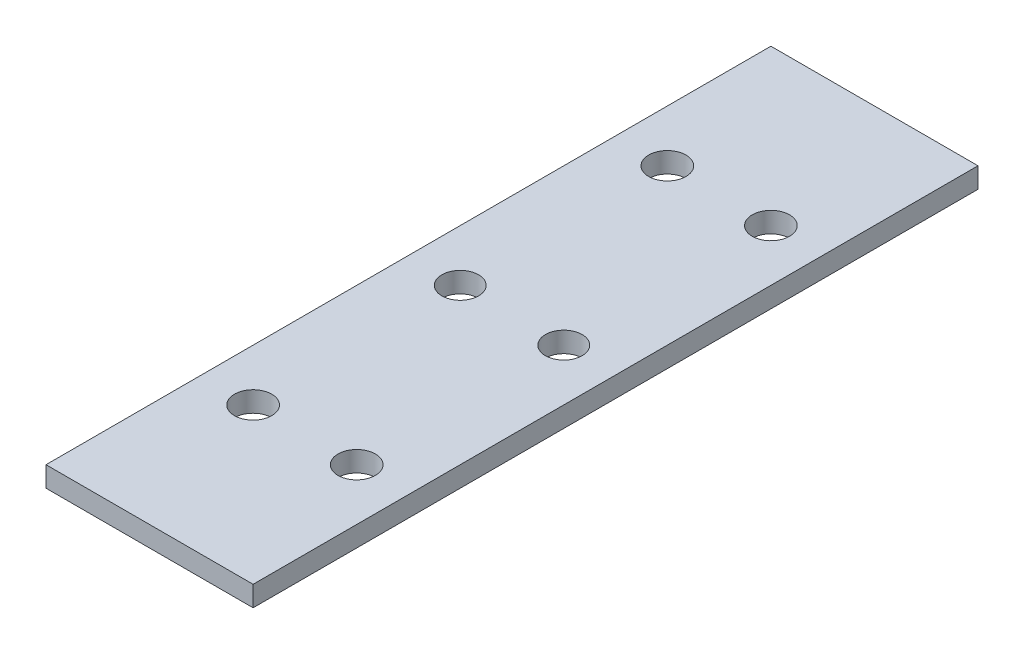
ISO-10303-21;
HEADER;
FILE_DESCRIPTION(('STEP AP214'),'2;1');
FILE_NAME('part.step','',(''),(''),'','','');
FILE_SCHEMA(('AUTOMOTIVE_DESIGN { 1 0 10303 214 1 1 1 1 }'));
ENDSEC;
DATA;
#1=APPLICATION_CONTEXT('core data for automotive mechanical design processes');
#2=APPLICATION_PROTOCOL_DEFINITION('international standard','automotive_design',2000,#1);
#3=PRODUCT_CONTEXT('',#1,'mechanical');
#4=PRODUCT('Part','Part','',(#3));
#5=PRODUCT_RELATED_PRODUCT_CATEGORY('part','',(#4));
#6=PRODUCT_DEFINITION_FORMATION('','',#4);
#7=PRODUCT_DEFINITION_CONTEXT('part definition',#1,'design');
#8=PRODUCT_DEFINITION('design','',#6,#7);
#9=PRODUCT_DEFINITION_SHAPE('','',#8);
#10=(LENGTH_UNIT() NAMED_UNIT(*) SI_UNIT(.MILLI.,.METRE.));
#11=(NAMED_UNIT(*) PLANE_ANGLE_UNIT() SI_UNIT($,.RADIAN.));
#12=(NAMED_UNIT(*) SI_UNIT($,.STERADIAN.) SOLID_ANGLE_UNIT());
#13=UNCERTAINTY_MEASURE_WITH_UNIT(LENGTH_MEASURE(1.E-05),#10,'distance_accuracy_value','');
#14=(GEOMETRIC_REPRESENTATION_CONTEXT(3) GLOBAL_UNCERTAINTY_ASSIGNED_CONTEXT((#13)) GLOBAL_UNIT_ASSIGNED_CONTEXT((#10,
#11,#12)) REPRESENTATION_CONTEXT('',''));
#15=CARTESIAN_POINT('',(0.,0.,0.));
#16=DIRECTION('',(0.,0.,1.));
#17=DIRECTION('',(1.,0.,0.));
#18=AXIS2_PLACEMENT_3D('',#15,#16,#17);
#19=CARTESIAN_POINT('',(0.,2.5,0.));
#20=DIRECTION('',(0.,-1.,0.));
#21=DIRECTION('',(0.,0.,-1.));
#22=AXIS2_PLACEMENT_3D('',#19,#20,#21);
#23=PLANE('',#22);
#24=CARTESIAN_POINT('',(19.0500000000005,2.5,-19.05));
#25=DIRECTION('',(0.,1.,0.));
#26=DIRECTION('',(0.,0.,1.));
#27=AXIS2_PLACEMENT_3D('',#24,#25,#26);
#28=CIRCLE('',#27,2.286);
#29=CARTESIAN_POINT('',(19.0500000000005,2.5,-16.764));
#30=VERTEX_POINT('',#29);
#31=EDGE_CURVE('E132',#30,#30,#28,.T.);
#32=ORIENTED_EDGE('',*,*,#31,.F.);
#33=EDGE_LOOP('',(#32));
#34=FACE_BOUND('',#33,.T.);
#35=CARTESIAN_POINT('',(19.05,2.5,-44.45));
#36=DIRECTION('',(0.,1.,0.));
#37=DIRECTION('',(0.,0.,1.));
#38=AXIS2_PLACEMENT_3D('',#35,#36,#37);
#39=CIRCLE('',#38,2.25);
#40=CARTESIAN_POINT('',(19.05,2.5,-42.2));
#41=VERTEX_POINT('',#40);
#42=EDGE_CURVE('E120',#41,#41,#39,.T.);
#43=ORIENTED_EDGE('',*,*,#42,.F.);
#44=EDGE_LOOP('',(#43));
#45=FACE_BOUND('',#44,.T.);
#46=CARTESIAN_POINT('',(6.35,2.5,-69.85));
#47=DIRECTION('',(0.,1.,0.));
#48=DIRECTION('',(0.,0.,1.));
#49=AXIS2_PLACEMENT_3D('',#46,#47,#48);
#50=CIRCLE('',#49,2.286);
#51=CARTESIAN_POINT('',(6.35,2.5,-67.564));
#52=VERTEX_POINT('',#51);
#53=EDGE_CURVE('E99',#52,#52,#50,.T.);
#54=ORIENTED_EDGE('',*,*,#53,.F.);
#55=EDGE_LOOP('',(#54));
#56=FACE_BOUND('',#55,.T.);
#57=DIRECTION('',(0.,0.,1.));
#58=VECTOR('',#57,1.);
#59=CARTESIAN_POINT('',(0.,2.5,0.));
#60=LINE('',#59,#58);
#61=CARTESIAN_POINT('',(0.,2.5,-88.9));
#62=VERTEX_POINT('',#61);
#63=CARTESIAN_POINT('',(0.,2.5,0.));
#64=VERTEX_POINT('',#63);
#65=EDGE_CURVE('E84',#62,#64,#60,.T.);
#66=ORIENTED_EDGE('',*,*,#65,.T.);
#67=DIRECTION('',(1.,0.,0.));
#68=VECTOR('',#67,1.);
#69=CARTESIAN_POINT('',(0.,2.5,0.));
#70=LINE('',#69,#68);
#71=CARTESIAN_POINT('',(25.4,2.5,0.));
#72=VERTEX_POINT('',#71);
#73=EDGE_CURVE('E79',#64,#72,#70,.T.);
#74=ORIENTED_EDGE('',*,*,#73,.T.);
#75=DIRECTION('',(0.,0.,-1.));
#76=VECTOR('',#75,1.);
#77=CARTESIAN_POINT('',(25.4,2.5,0.));
#78=LINE('',#77,#76);
#79=CARTESIAN_POINT('',(25.4,2.5,-88.9));
#80=VERTEX_POINT('',#79);
#81=EDGE_CURVE('E82',#72,#80,#78,.T.);
#82=ORIENTED_EDGE('',*,*,#81,.T.);
#83=DIRECTION('',(-1.,0.,0.));
#84=VECTOR('',#83,1.);
#85=CARTESIAN_POINT('',(0.,2.5,-88.9));
#86=LINE('',#85,#84);
#87=EDGE_CURVE('E49',#80,#62,#86,.T.);
#88=ORIENTED_EDGE('',*,*,#87,.T.);
#89=EDGE_LOOP('',(#66,#74,#82,#88));
#90=FACE_BOUND('',#89,.T.);
#91=CARTESIAN_POINT('',(6.35,2.5,-44.45));
#92=DIRECTION('',(0.,1.,0.));
#93=DIRECTION('',(0.,0.,1.));
#94=AXIS2_PLACEMENT_3D('',#91,#92,#93);
#95=CIRCLE('',#94,2.25);
#96=CARTESIAN_POINT('',(6.35,2.5,-42.2));
#97=VERTEX_POINT('',#96);
#98=EDGE_CURVE('E114',#97,#97,#95,.T.);
#99=ORIENTED_EDGE('',*,*,#98,.F.);
#100=EDGE_LOOP('',(#99));
#101=FACE_BOUND('',#100,.T.);
#102=CARTESIAN_POINT('',(19.05,2.5,-69.85));
#103=DIRECTION('',(0.,1.,0.));
#104=DIRECTION('',(0.,0.,1.));
#105=AXIS2_PLACEMENT_3D('',#102,#103,#104);
#106=CIRCLE('',#105,2.286);
#107=CARTESIAN_POINT('',(19.05,2.5,-67.564));
#108=VERTEX_POINT('',#107);
#109=EDGE_CURVE('E126',#108,#108,#106,.T.);
#110=ORIENTED_EDGE('',*,*,#109,.F.);
#111=EDGE_LOOP('',(#110));
#112=FACE_BOUND('',#111,.T.);
#113=CARTESIAN_POINT('',(6.35000000000053,2.5,-19.05));
#114=DIRECTION('',(0.,1.,0.));
#115=DIRECTION('',(0.,0.,1.));
#116=AXIS2_PLACEMENT_3D('',#113,#114,#115);
#117=CIRCLE('',#116,2.286);
#118=CARTESIAN_POINT('',(6.35000000000053,2.5,-16.764));
#119=VERTEX_POINT('',#118);
#120=EDGE_CURVE('E138',#119,#119,#117,.T.);
#121=ORIENTED_EDGE('',*,*,#120,.F.);
#122=EDGE_LOOP('',(#121));
#123=FACE_BOUND('',#122,.T.);
#124=ADVANCED_FACE('F32',(#34,#45,#56,#90,#101,#112,#123),#23,.F.);
#125=CARTESIAN_POINT('',(0.,0.,0.));
#126=DIRECTION('',(0.,-1.,0.));
#127=DIRECTION('',(0.,0.,-1.));
#128=AXIS2_PLACEMENT_3D('',#125,#126,#127);
#129=PLANE('',#128);
#130=CARTESIAN_POINT('',(19.0500000000005,0.,-19.05));
#131=DIRECTION('',(0.,1.,0.));
#132=DIRECTION('',(0.,0.,1.));
#133=AXIS2_PLACEMENT_3D('',#130,#131,#132);
#134=CIRCLE('',#133,2.286);
#135=CARTESIAN_POINT('',(19.0500000000005,0.,-16.764));
#136=VERTEX_POINT('',#135);
#137=EDGE_CURVE('E135',#136,#136,#134,.T.);
#138=ORIENTED_EDGE('',*,*,#137,.T.);
#139=EDGE_LOOP('',(#138));
#140=FACE_BOUND('',#139,.T.);
#141=CARTESIAN_POINT('',(19.05,0.,-44.45));
#142=DIRECTION('',(0.,1.,0.));
#143=DIRECTION('',(0.,0.,1.));
#144=AXIS2_PLACEMENT_3D('',#141,#142,#143);
#145=CIRCLE('',#144,2.25);
#146=CARTESIAN_POINT('',(19.05,0.,-42.2));
#147=VERTEX_POINT('',#146);
#148=EDGE_CURVE('E123',#147,#147,#145,.T.);
#149=ORIENTED_EDGE('',*,*,#148,.T.);
#150=EDGE_LOOP('',(#149));
#151=FACE_BOUND('',#150,.T.);
#152=CARTESIAN_POINT('',(6.35,0.,-69.85));
#153=DIRECTION('',(0.,1.,0.));
#154=DIRECTION('',(0.,0.,1.));
#155=AXIS2_PLACEMENT_3D('',#152,#153,#154);
#156=CIRCLE('',#155,2.286);
#157=CARTESIAN_POINT('',(6.35,0.,-67.564));
#158=VERTEX_POINT('',#157);
#159=EDGE_CURVE('E111',#158,#158,#156,.T.);
#160=ORIENTED_EDGE('',*,*,#159,.T.);
#161=EDGE_LOOP('',(#160));
#162=FACE_BOUND('',#161,.T.);
#163=DIRECTION('',(0.,0.,1.));
#164=VECTOR('',#163,1.);
#165=CARTESIAN_POINT('',(0.,0.,0.));
#166=LINE('',#165,#164);
#167=CARTESIAN_POINT('',(0.,0.,-88.9));
#168=VERTEX_POINT('',#167);
#169=CARTESIAN_POINT('',(0.,0.,0.));
#170=VERTEX_POINT('',#169);
#171=EDGE_CURVE('E96',#168,#170,#166,.T.);
#172=ORIENTED_EDGE('',*,*,#171,.F.);
#173=DIRECTION('',(-1.,0.,0.));
#174=VECTOR('',#173,1.);
#175=CARTESIAN_POINT('',(0.,0.,-88.9));
#176=LINE('',#175,#174);
#177=CARTESIAN_POINT('',(25.4,0.,-88.9));
#178=VERTEX_POINT('',#177);
#179=EDGE_CURVE('E72',#178,#168,#176,.T.);
#180=ORIENTED_EDGE('',*,*,#179,.F.);
#181=DIRECTION('',(0.,0.,-1.));
#182=VECTOR('',#181,1.);
#183=CARTESIAN_POINT('',(25.4,0.,0.));
#184=LINE('',#183,#182);
#185=CARTESIAN_POINT('',(25.4,0.,0.));
#186=VERTEX_POINT('',#185);
#187=EDGE_CURVE('E66',#186,#178,#184,.T.);
#188=ORIENTED_EDGE('',*,*,#187,.F.);
#189=DIRECTION('',(1.,0.,0.));
#190=VECTOR('',#189,1.);
#191=CARTESIAN_POINT('',(0.,0.,0.));
#192=LINE('',#191,#190);
#193=EDGE_CURVE('E88',#170,#186,#192,.T.);
#194=ORIENTED_EDGE('',*,*,#193,.F.);
#195=EDGE_LOOP('',(#172,#180,#188,#194));
#196=FACE_BOUND('',#195,.T.);
#197=CARTESIAN_POINT('',(6.35,0.,-44.45));
#198=DIRECTION('',(0.,1.,0.));
#199=DIRECTION('',(0.,0.,1.));
#200=AXIS2_PLACEMENT_3D('',#197,#198,#199);
#201=CIRCLE('',#200,2.25);
#202=CARTESIAN_POINT('',(6.35,0.,-42.2));
#203=VERTEX_POINT('',#202);
#204=EDGE_CURVE('E117',#203,#203,#201,.T.);
#205=ORIENTED_EDGE('',*,*,#204,.T.);
#206=EDGE_LOOP('',(#205));
#207=FACE_BOUND('',#206,.T.);
#208=CARTESIAN_POINT('',(19.05,0.,-69.85));
#209=DIRECTION('',(0.,1.,0.));
#210=DIRECTION('',(0.,0.,1.));
#211=AXIS2_PLACEMENT_3D('',#208,#209,#210);
#212=CIRCLE('',#211,2.286);
#213=CARTESIAN_POINT('',(19.05,0.,-67.564));
#214=VERTEX_POINT('',#213);
#215=EDGE_CURVE('E129',#214,#214,#212,.T.);
#216=ORIENTED_EDGE('',*,*,#215,.T.);
#217=EDGE_LOOP('',(#216));
#218=FACE_BOUND('',#217,.T.);
#219=CARTESIAN_POINT('',(6.35000000000053,0.,-19.05));
#220=DIRECTION('',(0.,1.,0.));
#221=DIRECTION('',(0.,0.,1.));
#222=AXIS2_PLACEMENT_3D('',#219,#220,#221);
#223=CIRCLE('',#222,2.286);
#224=CARTESIAN_POINT('',(6.35000000000053,0.,-16.764));
#225=VERTEX_POINT('',#224);
#226=EDGE_CURVE('E141',#225,#225,#223,.T.);
#227=ORIENTED_EDGE('',*,*,#226,.T.);
#228=EDGE_LOOP('',(#227));
#229=FACE_BOUND('',#228,.T.);
#230=ADVANCED_FACE('F107',(#140,#151,#162,#196,#207,#218,#229),#129,.T.);
#231=CARTESIAN_POINT('',(0.,2.5,0.));
#232=DIRECTION('',(1.,0.,0.));
#233=DIRECTION('',(0.,0.,-1.));
#234=AXIS2_PLACEMENT_3D('',#231,#232,#233);
#235=PLANE('',#234);
#236=ORIENTED_EDGE('',*,*,#171,.T.);
#237=DIRECTION('',(0.,-1.,0.));
#238=VECTOR('',#237,1.);
#239=CARTESIAN_POINT('',(0.,2.5,0.));
#240=LINE('',#239,#238);
#241=EDGE_CURVE('E11',#64,#170,#240,.T.);
#242=ORIENTED_EDGE('',*,*,#241,.F.);
#243=ORIENTED_EDGE('',*,*,#65,.F.);
#244=DIRECTION('',(0.,-1.,0.));
#245=VECTOR('',#244,1.);
#246=CARTESIAN_POINT('',(0.,2.5,-88.9));
#247=LINE('',#246,#245);
#248=EDGE_CURVE('E92',#62,#168,#247,.T.);
#249=ORIENTED_EDGE('',*,*,#248,.T.);
#250=EDGE_LOOP('',(#236,#242,#243,#249));
#251=FACE_BOUND('',#250,.T.);
#252=ADVANCED_FACE('F34',(#251),#235,.F.);
#253=CARTESIAN_POINT('',(0.,2.5,0.));
#254=DIRECTION('',(0.,0.,-1.));
#255=DIRECTION('',(-1.,0.,0.));
#256=AXIS2_PLACEMENT_3D('',#253,#254,#255);
#257=PLANE('',#256);
#258=ORIENTED_EDGE('',*,*,#193,.T.);
#259=DIRECTION('',(0.,-1.,0.));
#260=VECTOR('',#259,1.);
#261=CARTESIAN_POINT('',(25.4,2.5,0.));
#262=LINE('',#261,#260);
#263=EDGE_CURVE('E41',#72,#186,#262,.T.);
#264=ORIENTED_EDGE('',*,*,#263,.F.);
#265=ORIENTED_EDGE('',*,*,#73,.F.);
#266=ORIENTED_EDGE('',*,*,#241,.T.);
#267=EDGE_LOOP('',(#258,#264,#265,#266));
#268=FACE_BOUND('',#267,.T.);
#269=ADVANCED_FACE('F87',(#268),#257,.F.);
#270=CARTESIAN_POINT('',(25.4,2.5,0.));
#271=DIRECTION('',(-1.,0.,0.));
#272=DIRECTION('',(0.,0.,1.));
#273=AXIS2_PLACEMENT_3D('',#270,#271,#272);
#274=PLANE('',#273);
#275=ORIENTED_EDGE('',*,*,#187,.T.);
#276=DIRECTION('',(0.,-1.,0.));
#277=VECTOR('',#276,1.);
#278=CARTESIAN_POINT('',(25.4,2.5,-88.9));
#279=LINE('',#278,#277);
#280=EDGE_CURVE('E89',#80,#178,#279,.T.);
#281=ORIENTED_EDGE('',*,*,#280,.F.);
#282=ORIENTED_EDGE('',*,*,#81,.F.);
#283=ORIENTED_EDGE('',*,*,#263,.T.);
#284=EDGE_LOOP('',(#275,#281,#282,#283));
#285=FACE_BOUND('',#284,.T.);
#286=ADVANCED_FACE('F90',(#285),#274,.F.);
#287=CARTESIAN_POINT('',(0.,2.5,-88.9));
#288=DIRECTION('',(0.,0.,1.));
#289=DIRECTION('',(1.,0.,0.));
#290=AXIS2_PLACEMENT_3D('',#287,#288,#289);
#291=PLANE('',#290);
#292=ORIENTED_EDGE('',*,*,#179,.T.);
#293=ORIENTED_EDGE('',*,*,#248,.F.);
#294=ORIENTED_EDGE('',*,*,#87,.F.);
#295=ORIENTED_EDGE('',*,*,#280,.T.);
#296=EDGE_LOOP('',(#292,#293,#294,#295));
#297=FACE_BOUND('',#296,.T.);
#298=ADVANCED_FACE('F104',(#297),#291,.F.);
#299=CARTESIAN_POINT('',(6.35,2.5,-69.85));
#300=DIRECTION('',(0.,-1.,0.));
#301=DIRECTION('',(0.,0.,-1.));
#302=AXIS2_PLACEMENT_3D('',#299,#300,#301);
#303=CYLINDRICAL_SURFACE('',#302,2.286);
#304=ORIENTED_EDGE('',*,*,#53,.T.);
#305=EDGE_LOOP('',(#304));
#306=FACE_BOUND('',#305,.T.);
#307=ORIENTED_EDGE('',*,*,#159,.F.);
#308=EDGE_LOOP('',(#307));
#309=FACE_BOUND('',#308,.T.);
#310=ADVANCED_FACE('F161',(#306,#309),#303,.F.);
#311=CARTESIAN_POINT('',(6.35,2.5,-44.45));
#312=DIRECTION('',(0.,-1.,0.));
#313=DIRECTION('',(0.,0.,-1.));
#314=AXIS2_PLACEMENT_3D('',#311,#312,#313);
#315=CYLINDRICAL_SURFACE('',#314,2.25);
#316=ORIENTED_EDGE('',*,*,#98,.T.);
#317=EDGE_LOOP('',(#316));
#318=FACE_BOUND('',#317,.T.);
#319=ORIENTED_EDGE('',*,*,#204,.F.);
#320=EDGE_LOOP('',(#319));
#321=FACE_BOUND('',#320,.T.);
#322=ADVANCED_FACE('F207',(#318,#321),#315,.F.);
#323=CARTESIAN_POINT('',(19.05,2.5,-44.45));
#324=DIRECTION('',(0.,-1.,0.));
#325=DIRECTION('',(0.,0.,-1.));
#326=AXIS2_PLACEMENT_3D('',#323,#324,#325);
#327=CYLINDRICAL_SURFACE('',#326,2.25);
#328=ORIENTED_EDGE('',*,*,#42,.T.);
#329=EDGE_LOOP('',(#328));
#330=FACE_BOUND('',#329,.T.);
#331=ORIENTED_EDGE('',*,*,#148,.F.);
#332=EDGE_LOOP('',(#331));
#333=FACE_BOUND('',#332,.T.);
#334=ADVANCED_FACE('F215',(#330,#333),#327,.F.);
#335=CARTESIAN_POINT('',(19.05,2.5,-69.85));
#336=DIRECTION('',(0.,-1.,0.));
#337=DIRECTION('',(0.,0.,-1.));
#338=AXIS2_PLACEMENT_3D('',#335,#336,#337);
#339=CYLINDRICAL_SURFACE('',#338,2.286);
#340=ORIENTED_EDGE('',*,*,#109,.T.);
#341=EDGE_LOOP('',(#340));
#342=FACE_BOUND('',#341,.T.);
#343=ORIENTED_EDGE('',*,*,#215,.F.);
#344=EDGE_LOOP('',(#343));
#345=FACE_BOUND('',#344,.T.);
#346=ADVANCED_FACE('F223',(#342,#345),#339,.F.);
#347=CARTESIAN_POINT('',(19.0500000000005,2.5,-19.05));
#348=DIRECTION('',(0.,-1.,0.));
#349=DIRECTION('',(0.,0.,-1.));
#350=AXIS2_PLACEMENT_3D('',#347,#348,#349);
#351=CYLINDRICAL_SURFACE('',#350,2.286);
#352=ORIENTED_EDGE('',*,*,#31,.T.);
#353=EDGE_LOOP('',(#352));
#354=FACE_BOUND('',#353,.T.);
#355=ORIENTED_EDGE('',*,*,#137,.F.);
#356=EDGE_LOOP('',(#355));
#357=FACE_BOUND('',#356,.T.);
#358=ADVANCED_FACE('F232',(#354,#357),#351,.F.);
#359=CARTESIAN_POINT('',(6.35000000000053,2.5,-19.05));
#360=DIRECTION('',(0.,-1.,0.));
#361=DIRECTION('',(0.,0.,-1.));
#362=AXIS2_PLACEMENT_3D('',#359,#360,#361);
#363=CYLINDRICAL_SURFACE('',#362,2.286);
#364=ORIENTED_EDGE('',*,*,#120,.T.);
#365=EDGE_LOOP('',(#364));
#366=FACE_BOUND('',#365,.T.);
#367=ORIENTED_EDGE('',*,*,#226,.F.);
#368=EDGE_LOOP('',(#367));
#369=FACE_BOUND('',#368,.T.);
#370=ADVANCED_FACE('F147',(#366,#369),#363,.F.);
#371=CLOSED_SHELL('',(#124,#230,#252,#269,#286,#298,#310,#322,#334,#346,#358,#370));
#372=MANIFOLD_SOLID_BREP('B2',#371);
#373=ADVANCED_BREP_SHAPE_REPRESENTATION('',(#18,#372),#14);
#374=SHAPE_DEFINITION_REPRESENTATION(#9,#373);
ENDSEC;
END-ISO-10303-21;
